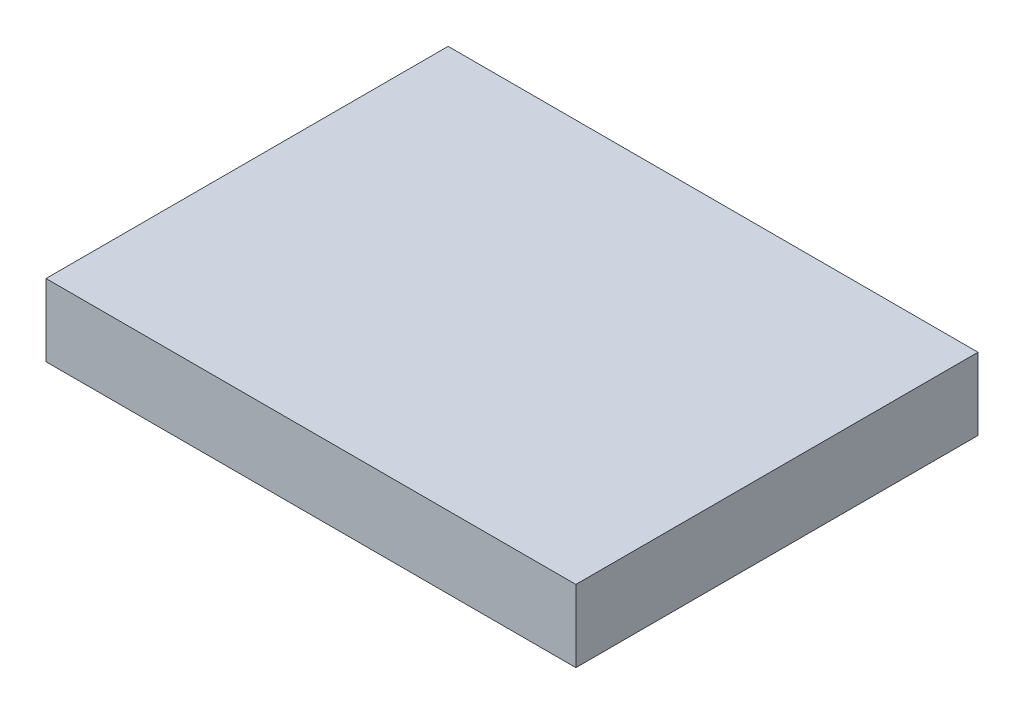
ISO-10303-21;
HEADER;
FILE_DESCRIPTION(('STEP AP214'),'2;1');
FILE_NAME('part.step','',(''),(''),'','','');
FILE_SCHEMA(('AUTOMOTIVE_DESIGN { 1 0 10303 214 1 1 1 1 }'));
ENDSEC;
DATA;
#1=APPLICATION_CONTEXT('core data for automotive mechanical design processes');
#2=APPLICATION_PROTOCOL_DEFINITION('international standard','automotive_design',2000,#1);
#3=PRODUCT_CONTEXT('',#1,'mechanical');
#4=PRODUCT('Part','Part','',(#3));
#5=PRODUCT_RELATED_PRODUCT_CATEGORY('part','',(#4));
#6=PRODUCT_DEFINITION_FORMATION('','',#4);
#7=PRODUCT_DEFINITION_CONTEXT('part definition',#1,'design');
#8=PRODUCT_DEFINITION('design','',#6,#7);
#9=PRODUCT_DEFINITION_SHAPE('','',#8);
#10=(LENGTH_UNIT() NAMED_UNIT(*) SI_UNIT(.MILLI.,.METRE.));
#11=(NAMED_UNIT(*) PLANE_ANGLE_UNIT() SI_UNIT($,.RADIAN.));
#12=(NAMED_UNIT(*) SI_UNIT($,.STERADIAN.) SOLID_ANGLE_UNIT());
#13=UNCERTAINTY_MEASURE_WITH_UNIT(LENGTH_MEASURE(1.E-05),#10,'distance_accuracy_value','');
#14=(GEOMETRIC_REPRESENTATION_CONTEXT(3) GLOBAL_UNCERTAINTY_ASSIGNED_CONTEXT((#13)) GLOBAL_UNIT_ASSIGNED_CONTEXT((#10,
#11,#12)) REPRESENTATION_CONTEXT('',''));
#15=CARTESIAN_POINT('',(0.,0.,0.));
#16=DIRECTION('',(0.,0.,1.));
#17=DIRECTION('',(1.,0.,0.));
#18=AXIS2_PLACEMENT_3D('',#15,#16,#17);
#19=CARTESIAN_POINT('',(8.16609999999999,2.2225,6.1976));
#20=DIRECTION('',(-1.,0.,0.));
#21=DIRECTION('',(0.,0.,1.));
#22=AXIS2_PLACEMENT_3D('',#19,#20,#21);
#23=PLANE('',#22);
#24=DIRECTION('',(0.,0.,-1.));
#25=VECTOR('',#24,1.);
#26=CARTESIAN_POINT('',(8.16609999999999,0.,6.1976));
#27=LINE('',#26,#25);
#28=CARTESIAN_POINT('',(8.16609999999999,0.,6.1976));
#29=VERTEX_POINT('',#28);
#30=CARTESIAN_POINT('',(8.16609999999999,0.,-6.1976));
#31=VERTEX_POINT('',#30);
#32=EDGE_CURVE('E96',#29,#31,#27,.T.);
#33=ORIENTED_EDGE('',*,*,#32,.T.);
#34=DIRECTION('',(0.,-1.,0.));
#35=VECTOR('',#34,1.);
#36=CARTESIAN_POINT('',(8.16609999999999,2.2225,-6.1976));
#37=LINE('',#36,#35);
#38=CARTESIAN_POINT('',(8.16609999999999,2.2225,-6.1976));
#39=VERTEX_POINT('',#38);
#40=EDGE_CURVE('E11',#39,#31,#37,.T.);
#41=ORIENTED_EDGE('',*,*,#40,.F.);
#42=DIRECTION('',(0.,0.,-1.));
#43=VECTOR('',#42,1.);
#44=CARTESIAN_POINT('',(8.16609999999999,2.2225,6.1976));
#45=LINE('',#44,#43);
#46=CARTESIAN_POINT('',(8.16609999999999,2.2225,6.1976));
#47=VERTEX_POINT('',#46);
#48=EDGE_CURVE('E84',#47,#39,#45,.T.);
#49=ORIENTED_EDGE('',*,*,#48,.F.);
#50=DIRECTION('',(0.,-1.,0.));
#51=VECTOR('',#50,1.);
#52=CARTESIAN_POINT('',(8.16609999999999,2.2225,6.1976));
#53=LINE('',#52,#51);
#54=EDGE_CURVE('E92',#47,#29,#53,.T.);
#55=ORIENTED_EDGE('',*,*,#54,.T.);
#56=EDGE_LOOP('',(#33,#41,#49,#55));
#57=FACE_BOUND('',#56,.T.);
#58=ADVANCED_FACE('F33',(#57),#23,.F.);
#59=CARTESIAN_POINT('',(-8.16610000000001,2.2225,-6.1976));
#60=DIRECTION('',(0.,0.,1.));
#61=DIRECTION('',(1.,0.,0.));
#62=AXIS2_PLACEMENT_3D('',#59,#60,#61);
#63=PLANE('',#62);
#64=DIRECTION('',(-1.,0.,0.));
#65=VECTOR('',#64,1.);
#66=CARTESIAN_POINT('',(-8.16610000000001,0.,-6.1976));
#67=LINE('',#66,#65);
#68=CARTESIAN_POINT('',(-8.16610000000001,0.,-6.1976));
#69=VERTEX_POINT('',#68);
#70=EDGE_CURVE('E88',#31,#69,#67,.T.);
#71=ORIENTED_EDGE('',*,*,#70,.T.);
#72=DIRECTION('',(0.,-1.,0.));
#73=VECTOR('',#72,1.);
#74=CARTESIAN_POINT('',(-8.16610000000001,2.2225,-6.1976));
#75=LINE('',#74,#73);
#76=CARTESIAN_POINT('',(-8.16610000000001,2.2225,-6.1976));
#77=VERTEX_POINT('',#76);
#78=EDGE_CURVE('E41',#77,#69,#75,.T.);
#79=ORIENTED_EDGE('',*,*,#78,.F.);
#80=DIRECTION('',(-1.,0.,0.));
#81=VECTOR('',#80,1.);
#82=CARTESIAN_POINT('',(-8.16610000000001,2.2225,-6.1976));
#83=LINE('',#82,#81);
#84=EDGE_CURVE('E79',#39,#77,#83,.T.);
#85=ORIENTED_EDGE('',*,*,#84,.F.);
#86=ORIENTED_EDGE('',*,*,#40,.T.);
#87=EDGE_LOOP('',(#71,#79,#85,#86));
#88=FACE_BOUND('',#87,.T.);
#89=ADVANCED_FACE('F87',(#88),#63,.F.);
#90=CARTESIAN_POINT('',(-8.16610000000001,2.2225,6.1976));
#91=DIRECTION('',(1.,0.,0.));
#92=DIRECTION('',(0.,0.,-1.));
#93=AXIS2_PLACEMENT_3D('',#90,#91,#92);
#94=PLANE('',#93);
#95=DIRECTION('',(0.,0.,1.));
#96=VECTOR('',#95,1.);
#97=CARTESIAN_POINT('',(-8.16610000000001,0.,6.1976));
#98=LINE('',#97,#96);
#99=CARTESIAN_POINT('',(-8.16610000000001,0.,6.1976));
#100=VERTEX_POINT('',#99);
#101=EDGE_CURVE('E66',#69,#100,#98,.T.);
#102=ORIENTED_EDGE('',*,*,#101,.T.);
#103=DIRECTION('',(0.,-1.,0.));
#104=VECTOR('',#103,1.);
#105=CARTESIAN_POINT('',(-8.16610000000001,2.2225,6.1976));
#106=LINE('',#105,#104);
#107=CARTESIAN_POINT('',(-8.16610000000001,2.2225,6.1976));
#108=VERTEX_POINT('',#107);
#109=EDGE_CURVE('E89',#108,#100,#106,.T.);
#110=ORIENTED_EDGE('',*,*,#109,.F.);
#111=DIRECTION('',(0.,0.,1.));
#112=VECTOR('',#111,1.);
#113=CARTESIAN_POINT('',(-8.16610000000001,2.2225,6.1976));
#114=LINE('',#113,#112);
#115=EDGE_CURVE('E82',#77,#108,#114,.T.);
#116=ORIENTED_EDGE('',*,*,#115,.F.);
#117=ORIENTED_EDGE('',*,*,#78,.T.);
#118=EDGE_LOOP('',(#102,#110,#116,#117));
#119=FACE_BOUND('',#118,.T.);
#120=ADVANCED_FACE('F90',(#119),#94,.F.);
#121=CARTESIAN_POINT('',(-8.16610000000001,2.2225,6.1976));
#122=DIRECTION('',(0.,0.,-1.));
#123=DIRECTION('',(-1.,0.,0.));
#124=AXIS2_PLACEMENT_3D('',#121,#122,#123);
#125=PLANE('',#124);
#126=DIRECTION('',(1.,0.,0.));
#127=VECTOR('',#126,1.);
#128=CARTESIAN_POINT('',(-8.16610000000001,0.,6.1976));
#129=LINE('',#128,#127);
#130=EDGE_CURVE('E72',#100,#29,#129,.T.);
#131=ORIENTED_EDGE('',*,*,#130,.T.);
#132=ORIENTED_EDGE('',*,*,#54,.F.);
#133=DIRECTION('',(1.,0.,0.));
#134=VECTOR('',#133,1.);
#135=CARTESIAN_POINT('',(-8.16610000000001,2.2225,6.1976));
#136=LINE('',#135,#134);
#137=EDGE_CURVE('E49',#108,#47,#136,.T.);
#138=ORIENTED_EDGE('',*,*,#137,.F.);
#139=ORIENTED_EDGE('',*,*,#109,.T.);
#140=EDGE_LOOP('',(#131,#132,#138,#139));
#141=FACE_BOUND('',#140,.T.);
#142=ADVANCED_FACE('F103',(#141),#125,.F.);
#143=CARTESIAN_POINT('',(0.,2.2225,0.));
#144=DIRECTION('',(0.,-1.,0.));
#145=DIRECTION('',(0.,0.,-1.));
#146=AXIS2_PLACEMENT_3D('',#143,#144,#145);
#147=PLANE('',#146);
#148=ORIENTED_EDGE('',*,*,#48,.T.);
#149=ORIENTED_EDGE('',*,*,#84,.T.);
#150=ORIENTED_EDGE('',*,*,#115,.T.);
#151=ORIENTED_EDGE('',*,*,#137,.T.);
#152=EDGE_LOOP('',(#148,#149,#150,#151));
#153=FACE_BOUND('',#152,.T.);
#154=ADVANCED_FACE('F80',(#153),#147,.F.);
#155=CARTESIAN_POINT('',(0.,0.,0.));
#156=DIRECTION('',(0.,-1.,0.));
#157=DIRECTION('',(0.,0.,-1.));
#158=AXIS2_PLACEMENT_3D('',#155,#156,#157);
#159=PLANE('',#158);
#160=ORIENTED_EDGE('',*,*,#32,.F.);
#161=ORIENTED_EDGE('',*,*,#130,.F.);
#162=ORIENTED_EDGE('',*,*,#101,.F.);
#163=ORIENTED_EDGE('',*,*,#70,.F.);
#164=EDGE_LOOP('',(#160,#161,#162,#163));
#165=FACE_BOUND('',#164,.T.);
#166=ADVANCED_FACE('F106',(#165),#159,.T.);
#167=CLOSED_SHELL('',(#58,#89,#120,#142,#154,#166));
#168=MANIFOLD_SOLID_BREP('B2',#167);
#169=ADVANCED_BREP_SHAPE_REPRESENTATION('',(#18,#168),#14);
#170=SHAPE_DEFINITION_REPRESENTATION(#9,#169);
ENDSEC;
END-ISO-10303-21;
